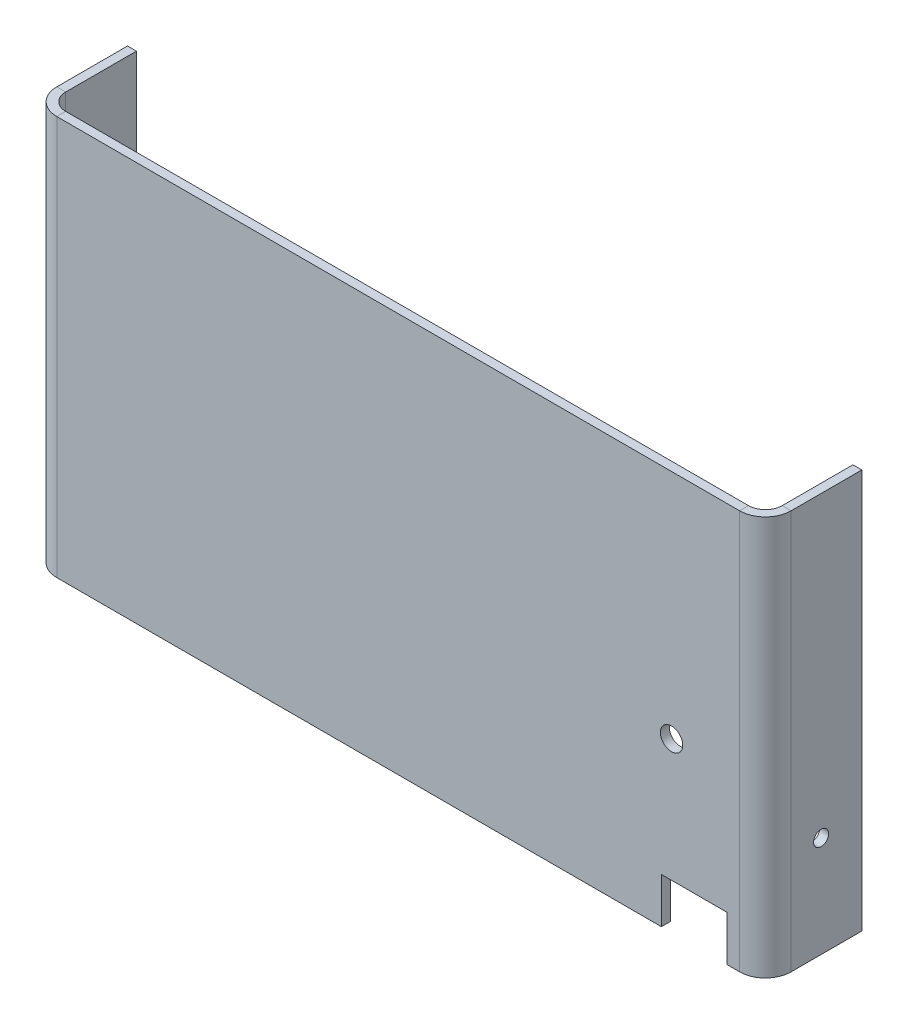
ISO-10303-21;
HEADER;
FILE_DESCRIPTION(('STEP AP214'),'2;1');
FILE_NAME('part.step','',(''),(''),'','','');
FILE_SCHEMA(('AUTOMOTIVE_DESIGN { 1 0 10303 214 1 1 1 1 }'));
ENDSEC;
DATA;
#1=APPLICATION_CONTEXT('core data for automotive mechanical design processes');
#2=APPLICATION_PROTOCOL_DEFINITION('international standard','automotive_design',2000,#1);
#3=PRODUCT_CONTEXT('',#1,'mechanical');
#4=PRODUCT('Part','Part','',(#3));
#5=PRODUCT_RELATED_PRODUCT_CATEGORY('part','',(#4));
#6=PRODUCT_DEFINITION_FORMATION('','',#4);
#7=PRODUCT_DEFINITION_CONTEXT('part definition',#1,'design');
#8=PRODUCT_DEFINITION('design','',#6,#7);
#9=PRODUCT_DEFINITION_SHAPE('','',#8);
#10=(LENGTH_UNIT() NAMED_UNIT(*) SI_UNIT(.MILLI.,.METRE.));
#11=(NAMED_UNIT(*) PLANE_ANGLE_UNIT() SI_UNIT($,.RADIAN.));
#12=(NAMED_UNIT(*) SI_UNIT($,.STERADIAN.) SOLID_ANGLE_UNIT());
#13=UNCERTAINTY_MEASURE_WITH_UNIT(LENGTH_MEASURE(1.E-05),#10,'distance_accuracy_value','');
#14=(GEOMETRIC_REPRESENTATION_CONTEXT(3) GLOBAL_UNCERTAINTY_ASSIGNED_CONTEXT((#13)) GLOBAL_UNIT_ASSIGNED_CONTEXT((#10,
#11,#12)) REPRESENTATION_CONTEXT('',''));
#15=CARTESIAN_POINT('',(0.,0.,0.));
#16=DIRECTION('',(0.,0.,1.));
#17=DIRECTION('',(1.,0.,0.));
#18=AXIS2_PLACEMENT_3D('',#15,#16,#17);
#19=CARTESIAN_POINT('',(-17.6037651662506,-31.75,2.54));
#20=DIRECTION('',(0.,-1.,0.));
#21=DIRECTION('',(1.,0.,0.));
#22=AXIS2_PLACEMENT_3D('',#19,#20,#21);
#23=PLANE('',#22);
#24=DIRECTION('',(1.,0.,0.));
#25=VECTOR('',#24,1.);
#26=CARTESIAN_POINT('',(-134.62,-31.75,1.1938));
#27=LINE('',#26,#25);
#28=CARTESIAN_POINT('',(-17.6037651662506,-31.75,1.1938));
#29=VERTEX_POINT('',#28);
#30=CARTESIAN_POINT('',(-15.7315628388125,-31.75,1.1938));
#31=VERTEX_POINT('',#30);
#32=EDGE_CURVE('E279',#29,#31,#27,.T.);
#33=ORIENTED_EDGE('',*,*,#32,.T.);
#34=DIRECTION('',(0.,0.,1.));
#35=VECTOR('',#34,1.);
#36=CARTESIAN_POINT('',(-15.7315628388125,-31.75,2.54));
#37=LINE('',#36,#35);
#38=CARTESIAN_POINT('',(-15.7315628388125,-31.75,2.54));
#39=VERTEX_POINT('',#38);
#40=EDGE_CURVE('E314',#31,#39,#37,.T.);
#41=ORIENTED_EDGE('',*,*,#40,.T.);
#42=DIRECTION('',(1.,0.,0.));
#43=VECTOR('',#42,1.);
#44=CARTESIAN_POINT('',(-17.6037651662506,-31.75,2.54));
#45=LINE('',#44,#43);
#46=CARTESIAN_POINT('',(-17.6037651662506,-31.75,2.54));
#47=VERTEX_POINT('',#46);
#48=EDGE_CURVE('E49',#47,#39,#45,.T.);
#49=ORIENTED_EDGE('',*,*,#48,.F.);
#50=DIRECTION('',(0.,0.,1.));
#51=VECTOR('',#50,1.);
#52=CARTESIAN_POINT('',(-17.6037651662506,-31.75,2.54));
#53=LINE('',#52,#51);
#54=EDGE_CURVE('E274',#29,#47,#53,.T.);
#55=ORIENTED_EDGE('',*,*,#54,.F.);
#56=EDGE_LOOP('',(#33,#41,#49,#55));
#57=FACE_BOUND('',#56,.T.);
#58=ADVANCED_FACE('F45',(#57),#23,.T.);
#59=CARTESIAN_POINT('',(-1.4190861483766E-13,28.575,2.54));
#60=DIRECTION('',(0.,1.,0.));
#61=DIRECTION('',(-1.,0.,0.));
#62=AXIS2_PLACEMENT_3D('',#59,#60,#61);
#63=PLANE('',#62);
#64=DIRECTION('',(-1.,0.,0.));
#65=VECTOR('',#64,1.);
#66=CARTESIAN_POINT('',(-1.4190861483766E-13,28.575,2.54));
#67=LINE('',#66,#65);
#68=CARTESIAN_POINT('',(-15.7315628388125,28.5749999999999,2.54));
#69=VERTEX_POINT('',#68);
#70=CARTESIAN_POINT('',(-118.888437161188,28.575,2.54));
#71=VERTEX_POINT('',#70);
#72=EDGE_CURVE('E275',#69,#71,#67,.T.);
#73=ORIENTED_EDGE('',*,*,#72,.F.);
#74=DIRECTION('',(0.,0.,-1.));
#75=VECTOR('',#74,1.);
#76=CARTESIAN_POINT('',(-15.7315628388125,28.575,2.54));
#77=LINE('',#76,#75);
#78=CARTESIAN_POINT('',(-15.7315628388125,28.575,1.1938));
#79=VERTEX_POINT('',#78);
#80=EDGE_CURVE('E12',#69,#79,#77,.T.);
#81=ORIENTED_EDGE('',*,*,#80,.T.);
#82=DIRECTION('',(1.,0.,0.));
#83=VECTOR('',#82,1.);
#84=CARTESIAN_POINT('',(-134.62,28.575,1.1938));
#85=LINE('',#84,#83);
#86=CARTESIAN_POINT('',(-118.888437161188,28.575,1.1938));
#87=VERTEX_POINT('',#86);
#88=EDGE_CURVE('E289',#79,#87,#85,.F.);
#89=ORIENTED_EDGE('',*,*,#88,.T.);
#90=DIRECTION('',(0.,0.,-1.));
#91=VECTOR('',#90,1.);
#92=CARTESIAN_POINT('',(-118.888437161188,28.575,2.54));
#93=LINE('',#92,#91);
#94=EDGE_CURVE('E301',#71,#87,#93,.T.);
#95=ORIENTED_EDGE('',*,*,#94,.F.);
#96=EDGE_LOOP('',(#73,#81,#89,#95));
#97=FACE_BOUND('',#96,.T.);
#98=ADVANCED_FACE('F47',(#97),#63,.T.);
#99=CARTESIAN_POINT('',(-134.62,-31.75,2.54));
#100=DIRECTION('',(0.,0.,1.));
#101=DIRECTION('',(1.,0.,0.));
#102=AXIS2_PLACEMENT_3D('',#99,#100,#101);
#103=PLANE('',#102);
#104=CARTESIAN_POINT('',(-26.0210000000003,-6.40070001477098,2.54));
#105=DIRECTION('',(0.,0.,1.));
#106=DIRECTION('',(1.,0.,0.));
#107=AXIS2_PLACEMENT_3D('',#104,#105,#106);
#108=CIRCLE('',#107,1.68394793953573);
#109=CARTESIAN_POINT('',(-24.3370520604646,-6.40070001477098,2.54));
#110=VERTEX_POINT('',#109);
#111=EDGE_CURVE('E271',#110,#110,#108,.T.);
#112=ORIENTED_EDGE('',*,*,#111,.F.);
#113=EDGE_LOOP('',(#112));
#114=FACE_BOUND('',#113,.T.);
#115=ORIENTED_EDGE('',*,*,#48,.T.);
#116=DIRECTION('',(0.,1.,0.));
#117=VECTOR('',#116,1.);
#118=CARTESIAN_POINT('',(-15.7315628388125,-31.75,2.54));
#119=LINE('',#118,#117);
#120=EDGE_CURVE('E309',#39,#69,#119,.T.);
#121=ORIENTED_EDGE('',*,*,#120,.T.);
#122=ORIENTED_EDGE('',*,*,#72,.T.);
#123=DIRECTION('',(0.,1.,0.));
#124=VECTOR('',#123,1.);
#125=CARTESIAN_POINT('',(-118.888437161188,-31.75,2.54));
#126=LINE('',#125,#124);
#127=CARTESIAN_POINT('',(-118.888437161188,-31.75,2.54));
#128=VERTEX_POINT('',#127);
#129=EDGE_CURVE('E298',#128,#71,#126,.T.);
#130=ORIENTED_EDGE('',*,*,#129,.F.);
#131=DIRECTION('',(1.,0.,0.));
#132=VECTOR('',#131,1.);
#133=CARTESIAN_POINT('',(-134.62,-31.75,2.54));
#134=LINE('',#133,#132);
#135=CARTESIAN_POINT('',(-27.5487101679567,-31.75,2.54));
#136=VERTEX_POINT('',#135);
#137=EDGE_CURVE('E265',#128,#136,#134,.T.);
#138=ORIENTED_EDGE('',*,*,#137,.T.);
#139=DIRECTION('',(0.,1.,0.));
#140=VECTOR('',#139,1.);
#141=CARTESIAN_POINT('',(-27.5487101679567,-31.75,2.54));
#142=LINE('',#141,#140);
#143=CARTESIAN_POINT('',(-27.5487101679567,-24.9109239929339,2.54));
#144=VERTEX_POINT('',#143);
#145=EDGE_CURVE('E261',#136,#144,#142,.T.);
#146=ORIENTED_EDGE('',*,*,#145,.T.);
#147=DIRECTION('',(1.,0.,0.));
#148=VECTOR('',#147,1.);
#149=CARTESIAN_POINT('',(-27.5487101679567,-24.9109239929339,2.54));
#150=LINE('',#149,#148);
#151=CARTESIAN_POINT('',(-17.6037651662506,-24.9109239929339,2.54));
#152=VERTEX_POINT('',#151);
#153=EDGE_CURVE('E264',#144,#152,#150,.T.);
#154=ORIENTED_EDGE('',*,*,#153,.T.);
#155=DIRECTION('',(0.,-1.,0.));
#156=VECTOR('',#155,1.);
#157=CARTESIAN_POINT('',(-17.6037651662506,-24.9109239929339,2.54));
#158=LINE('',#157,#156);
#159=EDGE_CURVE('E268',#152,#47,#158,.T.);
#160=ORIENTED_EDGE('',*,*,#159,.T.);
#161=EDGE_LOOP('',(#115,#121,#122,#130,#138,#146,#154,#160));
#162=FACE_BOUND('',#161,.T.);
#163=ADVANCED_FACE('F326',(#114,#162),#103,.T.);
#164=CARTESIAN_POINT('',(-134.62,-31.75,1.1938));
#165=DIRECTION('',(0.,0.,1.));
#166=DIRECTION('',(1.,0.,0.));
#167=AXIS2_PLACEMENT_3D('',#164,#165,#166);
#168=PLANE('',#167);
#169=DIRECTION('',(0.,1.,0.));
#170=VECTOR('',#169,1.);
#171=CARTESIAN_POINT('',(-15.7315628388125,-31.75,1.1938));
#172=LINE('',#171,#170);
#173=EDGE_CURVE('E54',#31,#79,#172,.T.);
#174=ORIENTED_EDGE('',*,*,#173,.F.);
#175=ORIENTED_EDGE('',*,*,#32,.F.);
#176=DIRECTION('',(0.,1.,0.));
#177=VECTOR('',#176,1.);
#178=CARTESIAN_POINT('',(-17.6037651662506,-31.75,1.1938));
#179=LINE('',#178,#177);
#180=CARTESIAN_POINT('',(-17.6037651662506,-24.9109239929339,1.1938));
#181=VERTEX_POINT('',#180);
#182=EDGE_CURVE('E276',#181,#29,#179,.F.);
#183=ORIENTED_EDGE('',*,*,#182,.F.);
#184=DIRECTION('',(1.,0.,0.));
#185=VECTOR('',#184,1.);
#186=CARTESIAN_POINT('',(-134.62,-24.9109239929339,1.1938));
#187=LINE('',#186,#185);
#188=CARTESIAN_POINT('',(-27.5487101679567,-24.9109239929339,1.1938));
#189=VERTEX_POINT('',#188);
#190=EDGE_CURVE('E280',#189,#181,#187,.T.);
#191=ORIENTED_EDGE('',*,*,#190,.F.);
#192=DIRECTION('',(0.,1.,0.));
#193=VECTOR('',#192,1.);
#194=CARTESIAN_POINT('',(-27.5487101679567,-31.75,1.1938));
#195=LINE('',#194,#193);
#196=CARTESIAN_POINT('',(-27.5487101679567,-31.75,1.1938));
#197=VERTEX_POINT('',#196);
#198=EDGE_CURVE('E283',#197,#189,#195,.T.);
#199=ORIENTED_EDGE('',*,*,#198,.F.);
#200=DIRECTION('',(1.,0.,0.));
#201=VECTOR('',#200,1.);
#202=CARTESIAN_POINT('',(-134.62,-31.75,1.1938));
#203=LINE('',#202,#201);
#204=CARTESIAN_POINT('',(-118.888437161188,-31.75,1.1938));
#205=VERTEX_POINT('',#204);
#206=EDGE_CURVE('E70',#205,#197,#203,.T.);
#207=ORIENTED_EDGE('',*,*,#206,.F.);
#208=DIRECTION('',(0.,1.,0.));
#209=VECTOR('',#208,1.);
#210=CARTESIAN_POINT('',(-118.888437161188,-31.75,1.1938));
#211=LINE('',#210,#209);
#212=EDGE_CURVE('E304',#205,#87,#211,.T.);
#213=ORIENTED_EDGE('',*,*,#212,.T.);
#214=ORIENTED_EDGE('',*,*,#88,.F.);
#215=EDGE_LOOP('',(#174,#175,#183,#191,#199,#207,#213,#214));
#216=FACE_BOUND('',#215,.T.);
#217=CARTESIAN_POINT('',(-26.0210000000003,-6.40070001477098,1.1938));
#218=DIRECTION('',(0.,0.,1.));
#219=DIRECTION('',(1.,0.,0.));
#220=AXIS2_PLACEMENT_3D('',#217,#218,#219);
#221=CIRCLE('',#220,1.68394793953573);
#222=CARTESIAN_POINT('',(-24.3370520604646,-6.40070001477098,1.1938));
#223=VERTEX_POINT('',#222);
#224=EDGE_CURVE('E286',#223,#223,#221,.T.);
#225=ORIENTED_EDGE('',*,*,#224,.T.);
#226=EDGE_LOOP('',(#225));
#227=FACE_BOUND('',#226,.T.);
#228=ADVANCED_FACE('F338',(#216,#227),#168,.F.);
#229=CARTESIAN_POINT('',(-27.5487101679567,-31.75,2.54));
#230=DIRECTION('',(1.,0.,0.));
#231=DIRECTION('',(0.,1.,0.));
#232=AXIS2_PLACEMENT_3D('',#229,#230,#231);
#233=PLANE('',#232);
#234=DIRECTION('',(0.,0.,1.));
#235=VECTOR('',#234,1.);
#236=CARTESIAN_POINT('',(-27.5487101679567,-31.75,2.54));
#237=LINE('',#236,#235);
#238=EDGE_CURVE('E295',#197,#136,#237,.T.);
#239=ORIENTED_EDGE('',*,*,#238,.F.);
#240=ORIENTED_EDGE('',*,*,#198,.T.);
#241=DIRECTION('',(0.,0.,1.));
#242=VECTOR('',#241,1.);
#243=CARTESIAN_POINT('',(-27.5487101679567,-24.9109239929339,2.54));
#244=LINE('',#243,#242);
#245=EDGE_CURVE('E293',#189,#144,#244,.T.);
#246=ORIENTED_EDGE('',*,*,#245,.T.);
#247=ORIENTED_EDGE('',*,*,#145,.F.);
#248=EDGE_LOOP('',(#239,#240,#246,#247));
#249=FACE_BOUND('',#248,.T.);
#250=ADVANCED_FACE('F370',(#249),#233,.T.);
#251=CARTESIAN_POINT('',(-27.5487101679567,-24.9109239929339,2.54));
#252=DIRECTION('',(0.,-1.,0.));
#253=DIRECTION('',(1.,0.,0.));
#254=AXIS2_PLACEMENT_3D('',#251,#252,#253);
#255=PLANE('',#254);
#256=ORIENTED_EDGE('',*,*,#245,.F.);
#257=ORIENTED_EDGE('',*,*,#190,.T.);
#258=DIRECTION('',(0.,0.,1.));
#259=VECTOR('',#258,1.);
#260=CARTESIAN_POINT('',(-17.6037651662506,-24.9109239929339,2.54));
#261=LINE('',#260,#259);
#262=EDGE_CURVE('E291',#181,#152,#261,.T.);
#263=ORIENTED_EDGE('',*,*,#262,.T.);
#264=ORIENTED_EDGE('',*,*,#153,.F.);
#265=EDGE_LOOP('',(#256,#257,#263,#264));
#266=FACE_BOUND('',#265,.T.);
#267=ADVANCED_FACE('F375',(#266),#255,.T.);
#268=CARTESIAN_POINT('',(-17.6037651662506,-24.9109239929339,2.54));
#269=DIRECTION('',(-1.,0.,0.));
#270=DIRECTION('',(0.,-1.,0.));
#271=AXIS2_PLACEMENT_3D('',#268,#269,#270);
#272=PLANE('',#271);
#273=ORIENTED_EDGE('',*,*,#262,.F.);
#274=ORIENTED_EDGE('',*,*,#182,.T.);
#275=ORIENTED_EDGE('',*,*,#54,.T.);
#276=ORIENTED_EDGE('',*,*,#159,.F.);
#277=EDGE_LOOP('',(#273,#274,#275,#276));
#278=FACE_BOUND('',#277,.T.);
#279=ADVANCED_FACE('F397',(#278),#272,.T.);
#280=CARTESIAN_POINT('',(-134.62,-31.75,2.54));
#281=DIRECTION('',(0.,-1.,0.));
#282=DIRECTION('',(1.,0.,0.));
#283=AXIS2_PLACEMENT_3D('',#280,#281,#282);
#284=PLANE('',#283);
#285=DIRECTION('',(0.,0.,1.));
#286=VECTOR('',#285,1.);
#287=CARTESIAN_POINT('',(-118.888437161188,-31.75,2.54));
#288=LINE('',#287,#286);
#289=EDGE_CURVE('E306',#205,#128,#288,.T.);
#290=ORIENTED_EDGE('',*,*,#289,.F.);
#291=ORIENTED_EDGE('',*,*,#206,.T.);
#292=ORIENTED_EDGE('',*,*,#238,.T.);
#293=ORIENTED_EDGE('',*,*,#137,.F.);
#294=EDGE_LOOP('',(#290,#291,#292,#293));
#295=FACE_BOUND('',#294,.T.);
#296=ADVANCED_FACE('F387',(#295),#284,.T.);
#297=CARTESIAN_POINT('',(-26.0210000000003,-6.40070001477098,2.54));
#298=DIRECTION('',(0.,0.,1.));
#299=DIRECTION('',(1.,0.,0.));
#300=AXIS2_PLACEMENT_3D('',#297,#298,#299);
#301=CYLINDRICAL_SURFACE('',#300,1.68394793953573);
#302=ORIENTED_EDGE('',*,*,#111,.T.);
#303=EDGE_LOOP('',(#302));
#304=FACE_BOUND('',#303,.T.);
#305=ORIENTED_EDGE('',*,*,#224,.F.);
#306=EDGE_LOOP('',(#305));
#307=FACE_BOUND('',#306,.T.);
#308=ADVANCED_FACE('F383',(#304,#307),#301,.F.);
#309=CARTESIAN_POINT('',(-118.888437161188,-31.75,-1.3462));
#310=DIRECTION('',(0.,-1.,0.));
#311=DIRECTION('',(0.,0.,-1.));
#312=AXIS2_PLACEMENT_3D('',#309,#310,#311);
#313=PLANE('',#312);
#314=DIRECTION('',(-1.,0.,0.));
#315=VECTOR('',#314,1.);
#316=CARTESIAN_POINT('',(-122.774637161188,-31.75,-1.34620000000002));
#317=LINE('',#316,#315);
#318=CARTESIAN_POINT('',(-121.428437161188,-31.75,-1.34620000000001));
#319=VERTEX_POINT('',#318);
#320=CARTESIAN_POINT('',(-122.774637161188,-31.75,-1.34620000000001));
#321=VERTEX_POINT('',#320);
#322=EDGE_CURVE('E220',#319,#321,#317,.T.);
#323=ORIENTED_EDGE('',*,*,#322,.F.);
#324=CARTESIAN_POINT('',(-118.888437161188,-31.75,-1.3462));
#325=DIRECTION('',(0.,-1.,0.));
#326=DIRECTION('',(0.,0.,-1.));
#327=AXIS2_PLACEMENT_3D('',#324,#325,#326);
#328=CIRCLE('',#327,2.54);
#329=EDGE_CURVE('E222',#319,#205,#328,.F.);
#330=ORIENTED_EDGE('',*,*,#329,.T.);
#331=ORIENTED_EDGE('',*,*,#289,.T.);
#332=CARTESIAN_POINT('',(-118.888437161188,-31.75,-1.3462));
#333=DIRECTION('',(0.,1.,0.));
#334=DIRECTION('',(0.,0.,1.));
#335=AXIS2_PLACEMENT_3D('',#332,#333,#334);
#336=CIRCLE('',#335,3.8862);
#337=EDGE_CURVE('E250',#321,#128,#336,.T.);
#338=ORIENTED_EDGE('',*,*,#337,.F.);
#339=EDGE_LOOP('',(#323,#330,#331,#338));
#340=FACE_BOUND('',#339,.T.);
#341=ADVANCED_FACE('F386',(#340),#313,.T.);
#342=CARTESIAN_POINT('',(-118.888437161188,28.575,-1.3462));
#343=DIRECTION('',(0.,1.,0.));
#344=DIRECTION('',(0.,0.,1.));
#345=AXIS2_PLACEMENT_3D('',#342,#343,#344);
#346=PLANE('',#345);
#347=CARTESIAN_POINT('',(-118.888437161188,28.575,-1.3462));
#348=DIRECTION('',(0.,-1.,0.));
#349=DIRECTION('',(0.,0.,-1.));
#350=AXIS2_PLACEMENT_3D('',#347,#348,#349);
#351=CIRCLE('',#350,2.54);
#352=CARTESIAN_POINT('',(-121.428437161188,28.575,-1.34620000000001));
#353=VERTEX_POINT('',#352);
#354=EDGE_CURVE('E254',#87,#353,#351,.T.);
#355=ORIENTED_EDGE('',*,*,#354,.T.);
#356=DIRECTION('',(1.,0.,0.));
#357=VECTOR('',#356,1.);
#358=CARTESIAN_POINT('',(-122.774637161188,28.575,-1.34620000000002));
#359=LINE('',#358,#357);
#360=CARTESIAN_POINT('',(-122.774637161188,28.575,-1.34620000000002));
#361=VERTEX_POINT('',#360);
#362=EDGE_CURVE('E230',#361,#353,#359,.T.);
#363=ORIENTED_EDGE('',*,*,#362,.F.);
#364=CARTESIAN_POINT('',(-118.888437161188,28.575,-1.3462));
#365=DIRECTION('',(0.,-1.,0.));
#366=DIRECTION('',(0.,0.,-1.));
#367=AXIS2_PLACEMENT_3D('',#364,#365,#366);
#368=CIRCLE('',#367,3.8862);
#369=EDGE_CURVE('E253',#71,#361,#368,.T.);
#370=ORIENTED_EDGE('',*,*,#369,.F.);
#371=ORIENTED_EDGE('',*,*,#94,.T.);
#372=EDGE_LOOP('',(#355,#363,#370,#371));
#373=FACE_BOUND('',#372,.T.);
#374=ADVANCED_FACE('F394',(#373),#346,.T.);
#375=CARTESIAN_POINT('',(-118.888437161188,58.9632337448997,-1.3462));
#376=DIRECTION('',(0.,-1.,0.));
#377=DIRECTION('',(0.,0.,-1.));
#378=AXIS2_PLACEMENT_3D('',#375,#376,#377);
#379=CYLINDRICAL_SURFACE('',#378,3.8862);
#380=ORIENTED_EDGE('',*,*,#129,.T.);
#381=ORIENTED_EDGE('',*,*,#369,.T.);
#382=DIRECTION('',(0.,1.,0.));
#383=VECTOR('',#382,1.);
#384=CARTESIAN_POINT('',(-122.774637161188,-31.75,-1.34620000000002));
#385=LINE('',#384,#383);
#386=EDGE_CURVE('E238',#321,#361,#385,.T.);
#387=ORIENTED_EDGE('',*,*,#386,.F.);
#388=ORIENTED_EDGE('',*,*,#337,.T.);
#389=EDGE_LOOP('',(#380,#381,#387,#388));
#390=FACE_BOUND('',#389,.T.);
#391=ADVANCED_FACE('F407',(#390),#379,.T.);
#392=CARTESIAN_POINT('',(-118.888437161188,58.9632337448997,-1.3462));
#393=DIRECTION('',(0.,-1.,0.));
#394=DIRECTION('',(0.,0.,-1.));
#395=AXIS2_PLACEMENT_3D('',#392,#393,#394);
#396=CYLINDRICAL_SURFACE('',#395,2.54);
#397=ORIENTED_EDGE('',*,*,#212,.F.);
#398=ORIENTED_EDGE('',*,*,#329,.F.);
#399=DIRECTION('',(0.,1.,0.));
#400=VECTOR('',#399,1.);
#401=CARTESIAN_POINT('',(-121.428437161188,-31.75,-1.34620000000001));
#402=LINE('',#401,#400);
#403=EDGE_CURVE('E217',#319,#353,#402,.T.);
#404=ORIENTED_EDGE('',*,*,#403,.T.);
#405=ORIENTED_EDGE('',*,*,#354,.F.);
#406=EDGE_LOOP('',(#397,#398,#404,#405));
#407=FACE_BOUND('',#406,.T.);
#408=ADVANCED_FACE('F410',(#407),#396,.F.);
#409=CARTESIAN_POINT('',(-122.774637161188,28.575,-12.0306371611877));
#410=DIRECTION('',(0.,0.,-1.));
#411=DIRECTION('',(0.,-1.,0.));
#412=AXIS2_PLACEMENT_3D('',#409,#410,#411);
#413=PLANE('',#412);
#414=DIRECTION('',(-1.,0.,0.));
#415=VECTOR('',#414,1.);
#416=CARTESIAN_POINT('',(-122.774637161188,28.575,-12.0306371611877));
#417=LINE('',#416,#415);
#418=CARTESIAN_POINT('',(-121.428437161188,28.575,-12.0306371611877));
#419=VERTEX_POINT('',#418);
#420=CARTESIAN_POINT('',(-122.774637161188,28.575,-12.0306371611877));
#421=VERTEX_POINT('',#420);
#422=EDGE_CURVE('E225',#419,#421,#417,.T.);
#423=ORIENTED_EDGE('',*,*,#422,.F.);
#424=DIRECTION('',(0.,1.,0.));
#425=VECTOR('',#424,1.);
#426=CARTESIAN_POINT('',(-121.428437161188,-31.75,-12.0306371611877));
#427=LINE('',#426,#425);
#428=CARTESIAN_POINT('',(-121.428437161188,-31.75,-12.0306371611877));
#429=VERTEX_POINT('',#428);
#430=EDGE_CURVE('E245',#419,#429,#427,.F.);
#431=ORIENTED_EDGE('',*,*,#430,.T.);
#432=DIRECTION('',(-1.,0.,0.));
#433=VECTOR('',#432,1.);
#434=CARTESIAN_POINT('',(-122.774637161188,-31.75,-12.0306371611877));
#435=LINE('',#434,#433);
#436=CARTESIAN_POINT('',(-122.774637161188,-31.75,-12.0306371611877));
#437=VERTEX_POINT('',#436);
#438=EDGE_CURVE('E243',#429,#437,#435,.T.);
#439=ORIENTED_EDGE('',*,*,#438,.T.);
#440=DIRECTION('',(0.,-1.,0.));
#441=VECTOR('',#440,1.);
#442=CARTESIAN_POINT('',(-122.774637161188,28.575,-12.0306371611877));
#443=LINE('',#442,#441);
#444=EDGE_CURVE('E233',#421,#437,#443,.T.);
#445=ORIENTED_EDGE('',*,*,#444,.F.);
#446=EDGE_LOOP('',(#423,#431,#439,#445));
#447=FACE_BOUND('',#446,.T.);
#448=ADVANCED_FACE('F413',(#447),#413,.T.);
#449=CARTESIAN_POINT('',(-122.774637161188,-31.75,-12.0306371611877));
#450=DIRECTION('',(-1.,0.,0.));
#451=DIRECTION('',(0.,0.,1.));
#452=AXIS2_PLACEMENT_3D('',#449,#450,#451);
#453=PLANE('',#452);
#454=DIRECTION('',(0.,0.,1.));
#455=VECTOR('',#454,1.);
#456=CARTESIAN_POINT('',(-122.774637161188,-31.75,-12.0306371611877));
#457=LINE('',#456,#455);
#458=EDGE_CURVE('E240',#437,#321,#457,.T.);
#459=ORIENTED_EDGE('',*,*,#458,.T.);
#460=ORIENTED_EDGE('',*,*,#386,.T.);
#461=DIRECTION('',(0.,0.,-1.));
#462=VECTOR('',#461,1.);
#463=CARTESIAN_POINT('',(-122.774637161188,28.575,122.589362838812));
#464=LINE('',#463,#462);
#465=EDGE_CURVE('E236',#361,#421,#464,.T.);
#466=ORIENTED_EDGE('',*,*,#465,.T.);
#467=ORIENTED_EDGE('',*,*,#444,.T.);
#468=EDGE_LOOP('',(#459,#460,#466,#467));
#469=FACE_BOUND('',#468,.T.);
#470=ADVANCED_FACE('F429',(#469),#453,.T.);
#471=CARTESIAN_POINT('',(-122.774637161188,28.575,122.589362838812));
#472=DIRECTION('',(0.,1.,0.));
#473=DIRECTION('',(0.,0.,-1.));
#474=AXIS2_PLACEMENT_3D('',#471,#472,#473);
#475=PLANE('',#474);
#476=ORIENTED_EDGE('',*,*,#465,.F.);
#477=ORIENTED_EDGE('',*,*,#362,.T.);
#478=DIRECTION('',(0.,0.,1.));
#479=VECTOR('',#478,1.);
#480=CARTESIAN_POINT('',(-121.428437161188,28.575,-12.0306371611877));
#481=LINE('',#480,#479);
#482=EDGE_CURVE('E228',#353,#419,#481,.F.);
#483=ORIENTED_EDGE('',*,*,#482,.T.);
#484=ORIENTED_EDGE('',*,*,#422,.T.);
#485=EDGE_LOOP('',(#476,#477,#483,#484));
#486=FACE_BOUND('',#485,.T.);
#487=ADVANCED_FACE('F425',(#486),#475,.T.);
#488=CARTESIAN_POINT('',(-121.428437161188,-31.75,-12.0306371611877));
#489=DIRECTION('',(-1.,0.,0.));
#490=DIRECTION('',(0.,0.,1.));
#491=AXIS2_PLACEMENT_3D('',#488,#489,#490);
#492=PLANE('',#491);
#493=ORIENTED_EDGE('',*,*,#403,.F.);
#494=DIRECTION('',(0.,0.,1.));
#495=VECTOR('',#494,1.);
#496=CARTESIAN_POINT('',(-121.428437161188,-31.75,-12.0306371611877));
#497=LINE('',#496,#495);
#498=EDGE_CURVE('E223',#429,#319,#497,.T.);
#499=ORIENTED_EDGE('',*,*,#498,.F.);
#500=ORIENTED_EDGE('',*,*,#430,.F.);
#501=ORIENTED_EDGE('',*,*,#482,.F.);
#502=EDGE_LOOP('',(#493,#499,#500,#501));
#503=FACE_BOUND('',#502,.T.);
#504=ADVANCED_FACE('F421',(#503),#492,.F.);
#505=CARTESIAN_POINT('',(-122.774637161188,-31.75,-12.0306371611877));
#506=DIRECTION('',(0.,-1.,0.));
#507=DIRECTION('',(0.,0.,1.));
#508=AXIS2_PLACEMENT_3D('',#505,#506,#507);
#509=PLANE('',#508);
#510=ORIENTED_EDGE('',*,*,#498,.T.);
#511=ORIENTED_EDGE('',*,*,#322,.T.);
#512=ORIENTED_EDGE('',*,*,#458,.F.);
#513=ORIENTED_EDGE('',*,*,#438,.F.);
#514=EDGE_LOOP('',(#510,#511,#512,#513));
#515=FACE_BOUND('',#514,.T.);
#516=ADVANCED_FACE('F418',(#515),#509,.T.);
#517=CARTESIAN_POINT('',(-15.7315628388125,-31.75,-1.3462));
#518=DIRECTION('',(0.,-1.,0.));
#519=DIRECTION('',(0.,0.,-1.));
#520=AXIS2_PLACEMENT_3D('',#517,#518,#519);
#521=PLANE('',#520);
#522=ORIENTED_EDGE('',*,*,#40,.F.);
#523=CARTESIAN_POINT('',(-15.7315628388125,-31.75,-1.3462));
#524=DIRECTION('',(0.,1.,0.));
#525=DIRECTION('',(-1.,0.,0.));
#526=AXIS2_PLACEMENT_3D('',#523,#524,#525);
#527=CIRCLE('',#526,2.54);
#528=CARTESIAN_POINT('',(-13.1915628388125,-31.75,-1.34620000000001));
#529=VERTEX_POINT('',#528);
#530=EDGE_CURVE('E186',#31,#529,#527,.T.);
#531=ORIENTED_EDGE('',*,*,#530,.T.);
#532=DIRECTION('',(1.,0.,0.));
#533=VECTOR('',#532,1.);
#534=CARTESIAN_POINT('',(-11.8453628388125,-31.75,-1.34620000000002));
#535=LINE('',#534,#533);
#536=CARTESIAN_POINT('',(-11.8453628388125,-31.75,-1.34620000000001));
#537=VERTEX_POINT('',#536);
#538=EDGE_CURVE('E204',#529,#537,#535,.T.);
#539=ORIENTED_EDGE('',*,*,#538,.T.);
#540=CARTESIAN_POINT('',(-15.7315628388125,-31.75,-1.3462));
#541=DIRECTION('',(0.,1.,0.));
#542=DIRECTION('',(0.,0.,1.));
#543=AXIS2_PLACEMENT_3D('',#540,#541,#542);
#544=CIRCLE('',#543,3.8862);
#545=EDGE_CURVE('E212',#39,#537,#544,.T.);
#546=ORIENTED_EDGE('',*,*,#545,.F.);
#547=EDGE_LOOP('',(#522,#531,#539,#546));
#548=FACE_BOUND('',#547,.T.);
#549=ADVANCED_FACE('F334',(#548),#521,.T.);
#550=CARTESIAN_POINT('',(-15.7315628388125,28.575,-1.3462));
#551=DIRECTION('',(0.,1.,0.));
#552=DIRECTION('',(0.,0.,1.));
#553=AXIS2_PLACEMENT_3D('',#550,#551,#552);
#554=PLANE('',#553);
#555=CARTESIAN_POINT('',(-15.7315628388125,28.5749999999999,-1.3462));
#556=DIRECTION('',(0.,1.,0.));
#557=DIRECTION('',(-1.,0.,0.));
#558=AXIS2_PLACEMENT_3D('',#555,#556,#557);
#559=CIRCLE('',#558,2.54);
#560=CARTESIAN_POINT('',(-13.1915628388125,28.575,-1.34620000000001));
#561=VERTEX_POINT('',#560);
#562=EDGE_CURVE('E62',#561,#79,#559,.F.);
#563=ORIENTED_EDGE('',*,*,#562,.T.);
#564=ORIENTED_EDGE('',*,*,#80,.F.);
#565=CARTESIAN_POINT('',(-15.7315628388125,28.575,-1.3462));
#566=DIRECTION('',(0.,-1.,0.));
#567=DIRECTION('',(0.,0.,-1.));
#568=AXIS2_PLACEMENT_3D('',#565,#566,#567);
#569=CIRCLE('',#568,3.8862);
#570=CARTESIAN_POINT('',(-11.8453628388125,28.575,-1.34620000000001));
#571=VERTEX_POINT('',#570);
#572=EDGE_CURVE('E215',#571,#69,#569,.T.);
#573=ORIENTED_EDGE('',*,*,#572,.F.);
#574=DIRECTION('',(-1.,0.,0.));
#575=VECTOR('',#574,1.);
#576=CARTESIAN_POINT('',(-11.8453628388125,28.575,-1.34620000000002));
#577=LINE('',#576,#575);
#578=EDGE_CURVE('E207',#571,#561,#577,.T.);
#579=ORIENTED_EDGE('',*,*,#578,.T.);
#580=EDGE_LOOP('',(#563,#564,#573,#579));
#581=FACE_BOUND('',#580,.T.);
#582=ADVANCED_FACE('F343',(#581),#554,.T.);
#583=CARTESIAN_POINT('',(-15.7315628388125,-62.1382337448997,-1.3462));
#584=DIRECTION('',(0.,1.,0.));
#585=DIRECTION('',(-1.,0.,0.));
#586=AXIS2_PLACEMENT_3D('',#583,#584,#585);
#587=CYLINDRICAL_SURFACE('',#586,3.8862);
#588=DIRECTION('',(0.,1.,0.));
#589=VECTOR('',#588,1.);
#590=CARTESIAN_POINT('',(-11.8453628388125,-31.75,-1.34620000000001));
#591=LINE('',#590,#589);
#592=EDGE_CURVE('E209',#537,#571,#591,.T.);
#593=ORIENTED_EDGE('',*,*,#592,.T.);
#594=ORIENTED_EDGE('',*,*,#572,.T.);
#595=ORIENTED_EDGE('',*,*,#120,.F.);
#596=ORIENTED_EDGE('',*,*,#545,.T.);
#597=EDGE_LOOP('',(#593,#594,#595,#596));
#598=FACE_BOUND('',#597,.T.);
#599=ADVANCED_FACE('F345',(#598),#587,.T.);
#600=CARTESIAN_POINT('',(-15.7315628388125,-62.1382337448997,-1.3462));
#601=DIRECTION('',(0.,1.,0.));
#602=DIRECTION('',(-1.,0.,0.));
#603=AXIS2_PLACEMENT_3D('',#600,#601,#602);
#604=CYLINDRICAL_SURFACE('',#603,2.54);
#605=DIRECTION('',(0.,1.,0.));
#606=VECTOR('',#605,1.);
#607=CARTESIAN_POINT('',(-13.1915628388125,-31.75,-1.34620000000001));
#608=LINE('',#607,#606);
#609=EDGE_CURVE('E185',#529,#561,#608,.T.);
#610=ORIENTED_EDGE('',*,*,#609,.F.);
#611=ORIENTED_EDGE('',*,*,#530,.F.);
#612=ORIENTED_EDGE('',*,*,#173,.T.);
#613=ORIENTED_EDGE('',*,*,#562,.F.);
#614=EDGE_LOOP('',(#610,#611,#612,#613));
#615=FACE_BOUND('',#614,.T.);
#616=ADVANCED_FACE('F336',(#615),#604,.F.);
#617=CARTESIAN_POINT('',(-11.8453628388125,-16.4945863695827,-5.87932924365829));
#618=DIRECTION('',(1.,0.,0.));
#619=DIRECTION('',(0.,0.,-1.));
#620=AXIS2_PLACEMENT_3D('',#617,#618,#619);
#621=CYLINDRICAL_SURFACE('',#620,1.13402350588126);
#622=CARTESIAN_POINT('',(-11.8453628388125,-16.4945863695827,-5.87932924365829));
#623=DIRECTION('',(1.,0.,0.));
#624=DIRECTION('',(0.,0.,-1.));
#625=AXIS2_PLACEMENT_3D('',#622,#623,#624);
#626=CIRCLE('',#625,1.13402350588126);
#627=CARTESIAN_POINT('',(-11.8453628388125,-16.4945863695827,-7.01335274953955));
#628=VERTEX_POINT('',#627);
#629=EDGE_CURVE('E181',#628,#628,#626,.T.);
#630=ORIENTED_EDGE('',*,*,#629,.T.);
#631=EDGE_LOOP('',(#630));
#632=FACE_BOUND('',#631,.T.);
#633=CARTESIAN_POINT('',(-13.1915628388125,-16.4945863695827,-5.87932924365829));
#634=DIRECTION('',(1.,0.,0.));
#635=DIRECTION('',(0.,0.,-1.));
#636=AXIS2_PLACEMENT_3D('',#633,#634,#635);
#637=CIRCLE('',#636,1.13402350588126);
#638=CARTESIAN_POINT('',(-13.1915628388125,-16.4945863695827,-7.01335274953955));
#639=VERTEX_POINT('',#638);
#640=EDGE_CURVE('E190',#639,#639,#637,.T.);
#641=ORIENTED_EDGE('',*,*,#640,.F.);
#642=EDGE_LOOP('',(#641));
#643=FACE_BOUND('',#642,.T.);
#644=ADVANCED_FACE('F443',(#632,#643),#621,.F.);
#645=CARTESIAN_POINT('',(-11.8453628388125,-31.75,-12.0306371611877));
#646=DIRECTION('',(0.,0.,-1.));
#647=DIRECTION('',(0.,1.,0.));
#648=AXIS2_PLACEMENT_3D('',#645,#646,#647);
#649=PLANE('',#648);
#650=DIRECTION('',(1.,0.,0.));
#651=VECTOR('',#650,1.);
#652=CARTESIAN_POINT('',(-11.8453628388125,-31.75,-12.0306371611877));
#653=LINE('',#652,#651);
#654=CARTESIAN_POINT('',(-13.1915628388125,-31.75,-12.0306371611877));
#655=VERTEX_POINT('',#654);
#656=CARTESIAN_POINT('',(-11.8453628388125,-31.75,-12.0306371611877));
#657=VERTEX_POINT('',#656);
#658=EDGE_CURVE('E179',#655,#657,#653,.T.);
#659=ORIENTED_EDGE('',*,*,#658,.F.);
#660=DIRECTION('',(0.,1.,0.));
#661=VECTOR('',#660,1.);
#662=CARTESIAN_POINT('',(-13.1915628388125,-31.75,-12.0306371611877));
#663=LINE('',#662,#661);
#664=CARTESIAN_POINT('',(-13.1915628388125,28.575,-12.0306371611877));
#665=VERTEX_POINT('',#664);
#666=EDGE_CURVE('E173',#655,#665,#663,.T.);
#667=ORIENTED_EDGE('',*,*,#666,.T.);
#668=DIRECTION('',(1.,0.,0.));
#669=VECTOR('',#668,1.);
#670=CARTESIAN_POINT('',(-11.8453628388125,28.575,-12.0306371611877));
#671=LINE('',#670,#669);
#672=CARTESIAN_POINT('',(-11.8453628388125,28.575,-12.0306371611877));
#673=VERTEX_POINT('',#672);
#674=EDGE_CURVE('E161',#665,#673,#671,.T.);
#675=ORIENTED_EDGE('',*,*,#674,.T.);
#676=DIRECTION('',(0.,1.,0.));
#677=VECTOR('',#676,1.);
#678=CARTESIAN_POINT('',(-11.8453628388125,-31.75,-12.0306371611877));
#679=LINE('',#678,#677);
#680=EDGE_CURVE('E199',#657,#673,#679,.T.);
#681=ORIENTED_EDGE('',*,*,#680,.F.);
#682=EDGE_LOOP('',(#659,#667,#675,#681));
#683=FACE_BOUND('',#682,.T.);
#684=ADVANCED_FACE('F177',(#683),#649,.T.);
#685=CARTESIAN_POINT('',(-11.845362838812,-31.75,122.589362838812));
#686=DIRECTION('',(1.,0.,0.));
#687=DIRECTION('',(0.,0.,-1.));
#688=AXIS2_PLACEMENT_3D('',#685,#686,#687);
#689=PLANE('',#688);
#690=ORIENTED_EDGE('',*,*,#592,.F.);
#691=DIRECTION('',(0.,0.,-1.));
#692=VECTOR('',#691,1.);
#693=CARTESIAN_POINT('',(-11.8453628388125,-31.75,5.57312800506278));
#694=LINE('',#693,#692);
#695=EDGE_CURVE('E172',#537,#657,#694,.T.);
#696=ORIENTED_EDGE('',*,*,#695,.T.);
#697=ORIENTED_EDGE('',*,*,#680,.T.);
#698=DIRECTION('',(0.,0.,1.));
#699=VECTOR('',#698,1.);
#700=CARTESIAN_POINT('',(-11.8453628388125,28.575,-12.0306371611877));
#701=LINE('',#700,#699);
#702=EDGE_CURVE('E168',#673,#571,#701,.T.);
#703=ORIENTED_EDGE('',*,*,#702,.T.);
#704=EDGE_LOOP('',(#690,#696,#697,#703));
#705=FACE_BOUND('',#704,.T.);
#706=ORIENTED_EDGE('',*,*,#629,.F.);
#707=EDGE_LOOP('',(#706));
#708=FACE_BOUND('',#707,.T.);
#709=ADVANCED_FACE('F348',(#705,#708),#689,.T.);
#710=CARTESIAN_POINT('',(-11.8453628388125,-31.75,5.57312800506278));
#711=DIRECTION('',(0.,-1.,0.));
#712=DIRECTION('',(0.,0.,-1.));
#713=AXIS2_PLACEMENT_3D('',#710,#711,#712);
#714=PLANE('',#713);
#715=ORIENTED_EDGE('',*,*,#538,.F.);
#716=DIRECTION('',(0.,0.,-1.));
#717=VECTOR('',#716,1.);
#718=CARTESIAN_POINT('',(-13.1915628388121,-31.75,122.589362838812));
#719=LINE('',#718,#717);
#720=EDGE_CURVE('E196',#529,#655,#719,.T.);
#721=ORIENTED_EDGE('',*,*,#720,.T.);
#722=ORIENTED_EDGE('',*,*,#658,.T.);
#723=ORIENTED_EDGE('',*,*,#695,.F.);
#724=EDGE_LOOP('',(#715,#721,#722,#723));
#725=FACE_BOUND('',#724,.T.);
#726=ADVANCED_FACE('F352',(#725),#714,.T.);
#727=CARTESIAN_POINT('',(-13.1915628388121,-31.75,122.589362838812));
#728=DIRECTION('',(1.,0.,0.));
#729=DIRECTION('',(0.,0.,-1.));
#730=AXIS2_PLACEMENT_3D('',#727,#728,#729);
#731=PLANE('',#730);
#732=ORIENTED_EDGE('',*,*,#640,.T.);
#733=EDGE_LOOP('',(#732));
#734=FACE_BOUND('',#733,.T.);
#735=ORIENTED_EDGE('',*,*,#720,.F.);
#736=ORIENTED_EDGE('',*,*,#609,.T.);
#737=DIRECTION('',(0.,0.,-1.));
#738=VECTOR('',#737,1.);
#739=CARTESIAN_POINT('',(-13.1915628388121,28.575,122.589362838812));
#740=LINE('',#739,#738);
#741=EDGE_CURVE('E165',#665,#561,#740,.F.);
#742=ORIENTED_EDGE('',*,*,#741,.F.);
#743=ORIENTED_EDGE('',*,*,#666,.F.);
#744=EDGE_LOOP('',(#735,#736,#742,#743));
#745=FACE_BOUND('',#744,.T.);
#746=ADVANCED_FACE('F183',(#734,#745),#731,.F.);
#747=CARTESIAN_POINT('',(-11.8453628388125,28.575,-12.0306371611877));
#748=DIRECTION('',(0.,1.,0.));
#749=DIRECTION('',(0.,0.,1.));
#750=AXIS2_PLACEMENT_3D('',#747,#748,#749);
#751=PLANE('',#750);
#752=ORIENTED_EDGE('',*,*,#578,.F.);
#753=ORIENTED_EDGE('',*,*,#702,.F.);
#754=ORIENTED_EDGE('',*,*,#674,.F.);
#755=ORIENTED_EDGE('',*,*,#741,.T.);
#756=EDGE_LOOP('',(#752,#753,#754,#755));
#757=FACE_BOUND('',#756,.T.);
#758=ADVANCED_FACE('F163',(#757),#751,.T.);
#759=CLOSED_SHELL('',(#58,#98,#163,#228,#250,#267,#279,#296,#308,#341,#374,#391,#408,#448,#470,
#487,#504,#516,#549,#582,#599,#616,#644,#684,#709,#726,#746,#758));
#760=MANIFOLD_SOLID_BREP('B2',#759);
#761=ADVANCED_BREP_SHAPE_REPRESENTATION('',(#18,#760),#14);
#762=SHAPE_DEFINITION_REPRESENTATION(#9,#761);
ENDSEC;
END-ISO-10303-21;
